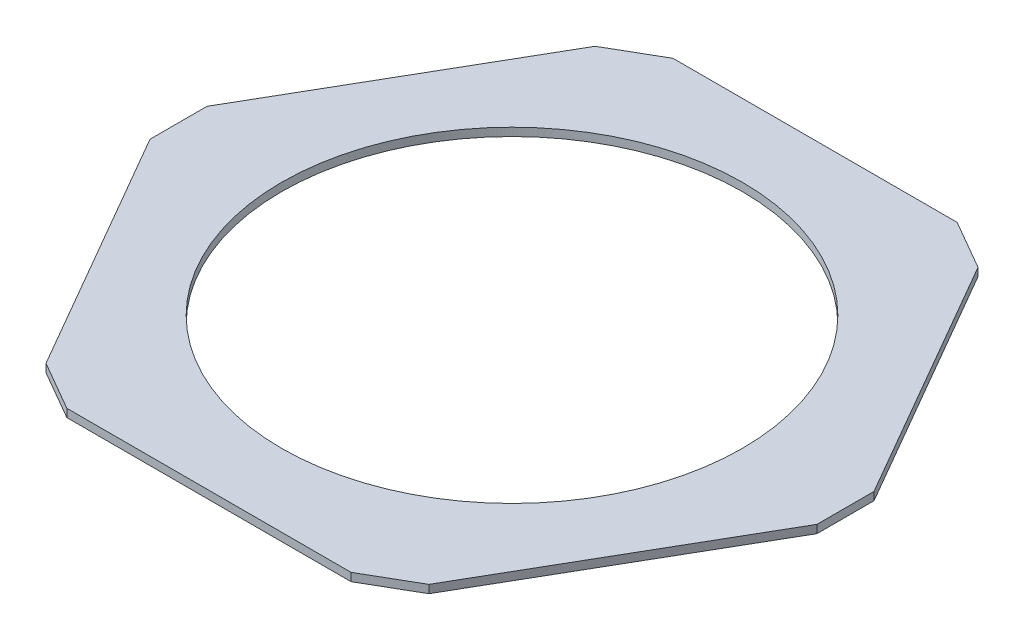
ISO-10303-21;
HEADER;
FILE_DESCRIPTION(('STEP AP214'),'2;1');
FILE_NAME('part.step','',(''),(''),'','','');
FILE_SCHEMA(('AUTOMOTIVE_DESIGN { 1 0 10303 214 1 1 1 1 }'));
ENDSEC;
DATA;
#1=APPLICATION_CONTEXT('core data for automotive mechanical design processes');
#2=APPLICATION_PROTOCOL_DEFINITION('international standard','automotive_design',2000,#1);
#3=PRODUCT_CONTEXT('',#1,'mechanical');
#4=PRODUCT('Part','Part','',(#3));
#5=PRODUCT_RELATED_PRODUCT_CATEGORY('part','',(#4));
#6=PRODUCT_DEFINITION_FORMATION('','',#4);
#7=PRODUCT_DEFINITION_CONTEXT('part definition',#1,'design');
#8=PRODUCT_DEFINITION('design','',#6,#7);
#9=PRODUCT_DEFINITION_SHAPE('','',#8);
#10=(LENGTH_UNIT() NAMED_UNIT(*) SI_UNIT(.MILLI.,.METRE.));
#11=(NAMED_UNIT(*) PLANE_ANGLE_UNIT() SI_UNIT($,.RADIAN.));
#12=(NAMED_UNIT(*) SI_UNIT($,.STERADIAN.) SOLID_ANGLE_UNIT());
#13=UNCERTAINTY_MEASURE_WITH_UNIT(LENGTH_MEASURE(1.E-05),#10,'distance_accuracy_value','');
#14=(GEOMETRIC_REPRESENTATION_CONTEXT(3) GLOBAL_UNCERTAINTY_ASSIGNED_CONTEXT((#13)) GLOBAL_UNIT_ASSIGNED_CONTEXT((#10,
#11,#12)) REPRESENTATION_CONTEXT('',''));
#15=CARTESIAN_POINT('',(0.,0.,0.));
#16=DIRECTION('',(0.,0.,1.));
#17=DIRECTION('',(1.,0.,0.));
#18=AXIS2_PLACEMENT_3D('',#15,#16,#17);
#19=CARTESIAN_POINT('',(438.317943801342,25.,-934.970880832121));
#20=DIRECTION('',(0.,0.,1.));
#21=DIRECTION('',(1.,0.,0.));
#22=AXIS2_PLACEMENT_3D('',#19,#20,#21);
#23=PLANE('',#22);
#24=DIRECTION('',(-1.,0.,0.));
#25=VECTOR('',#24,1.);
#26=CARTESIAN_POINT('',(438.317943801342,0.,-934.970880832121));
#27=LINE('',#26,#25);
#28=CARTESIAN_POINT('',(438.317943801342,0.,-934.970880832121));
#29=VERTEX_POINT('',#28);
#30=CARTESIAN_POINT('',(-438.317943801345,0.,-934.97088083212));
#31=VERTEX_POINT('',#30);
#32=EDGE_CURVE('E154',#29,#31,#27,.T.);
#33=ORIENTED_EDGE('',*,*,#32,.T.);
#34=DIRECTION('',(0.,-1.,0.));
#35=VECTOR('',#34,1.);
#36=CARTESIAN_POINT('',(-438.317943801345,25.,-934.97088083212));
#37=LINE('',#36,#35);
#38=CARTESIAN_POINT('',(-438.317943801345,25.,-934.97088083212));
#39=VERTEX_POINT('',#38);
#40=EDGE_CURVE('E11',#39,#31,#37,.T.);
#41=ORIENTED_EDGE('',*,*,#40,.F.);
#42=DIRECTION('',(-1.,0.,0.));
#43=VECTOR('',#42,1.);
#44=CARTESIAN_POINT('',(438.317943801342,25.,-934.970880832121));
#45=LINE('',#44,#43);
#46=CARTESIAN_POINT('',(438.317943801342,25.,-934.970880832121));
#47=VERTEX_POINT('',#46);
#48=EDGE_CURVE('E177',#47,#39,#45,.T.);
#49=ORIENTED_EDGE('',*,*,#48,.F.);
#50=DIRECTION('',(0.,-1.,0.));
#51=VECTOR('',#50,1.);
#52=CARTESIAN_POINT('',(438.317943801342,25.,-934.970880832121));
#53=LINE('',#52,#51);
#54=EDGE_CURVE('E150',#47,#29,#53,.T.);
#55=ORIENTED_EDGE('',*,*,#54,.T.);
#56=EDGE_LOOP('',(#33,#41,#49,#55));
#57=FACE_BOUND('',#56,.T.);
#58=ADVANCED_FACE('F34',(#57),#23,.F.);
#59=CARTESIAN_POINT('',(-590.549562698659,25.,-847.079914682582));
#60=DIRECTION('',(0.500000000000004,0.,0.866025403784436));
#61=DIRECTION('',(0.866025403784436,0.,-0.500000000000004));
#62=AXIS2_PLACEMENT_3D('',#59,#60,#61);
#63=PLANE('',#62);
#64=DIRECTION('',(-0.866025403784436,0.,0.500000000000004));
#65=VECTOR('',#64,1.);
#66=CARTESIAN_POINT('',(-590.549562698659,0.,-847.079914682582));
#67=LINE('',#66,#65);
#68=CARTESIAN_POINT('',(-590.549562698659,0.,-847.079914682582));
#69=VERTEX_POINT('',#68);
#70=EDGE_CURVE('E157',#31,#69,#67,.T.);
#71=ORIENTED_EDGE('',*,*,#70,.T.);
#72=DIRECTION('',(0.,-1.,0.));
#73=VECTOR('',#72,1.);
#74=CARTESIAN_POINT('',(-590.549562698659,25.,-847.079914682582));
#75=LINE('',#74,#73);
#76=CARTESIAN_POINT('',(-590.549562698659,25.,-847.079914682582));
#77=VERTEX_POINT('',#76);
#78=EDGE_CURVE('E42',#77,#69,#75,.T.);
#79=ORIENTED_EDGE('',*,*,#78,.F.);
#80=DIRECTION('',(-0.866025403784436,0.,0.500000000000004));
#81=VECTOR('',#80,1.);
#82=CARTESIAN_POINT('',(-590.549562698659,25.,-847.079914682582));
#83=LINE('',#82,#81);
#84=EDGE_CURVE('E105',#39,#77,#83,.T.);
#85=ORIENTED_EDGE('',*,*,#84,.F.);
#86=ORIENTED_EDGE('',*,*,#40,.T.);
#87=EDGE_LOOP('',(#71,#79,#85,#86));
#88=FACE_BOUND('',#87,.T.);
#89=ADVANCED_FACE('F256',(#88),#63,.F.);
#90=CARTESIAN_POINT('',(-590.549562698659,25.,-847.079914682582));
#91=DIRECTION('',(0.866025403784439,0.,0.499999999999999));
#92=DIRECTION('',(0.499999999999999,0.,-0.866025403784439));
#93=AXIS2_PLACEMENT_3D('',#90,#91,#92);
#94=PLANE('',#93);
#95=DIRECTION('',(-0.499999999999999,0.,0.866025403784439));
#96=VECTOR('',#95,1.);
#97=CARTESIAN_POINT('',(-590.549562698659,0.,-847.079914682582));
#98=LINE('',#97,#96);
#99=CARTESIAN_POINT('',(-1028.8675065,0.,-87.8909661495356));
#100=VERTEX_POINT('',#99);
#101=EDGE_CURVE('E160',#69,#100,#98,.T.);
#102=ORIENTED_EDGE('',*,*,#101,.T.);
#103=DIRECTION('',(0.,-1.,0.));
#104=VECTOR('',#103,1.);
#105=CARTESIAN_POINT('',(-1028.8675065,25.,-87.8909661495356));
#106=LINE('',#105,#104);
#107=CARTESIAN_POINT('',(-1028.8675065,25.,-87.8909661495356));
#108=VERTEX_POINT('',#107);
#109=EDGE_CURVE('E196',#108,#100,#106,.T.);
#110=ORIENTED_EDGE('',*,*,#109,.F.);
#111=DIRECTION('',(-0.499999999999999,0.,0.866025403784439));
#112=VECTOR('',#111,1.);
#113=CARTESIAN_POINT('',(-590.549562698659,25.,-847.079914682582));
#114=LINE('',#113,#112);
#115=EDGE_CURVE('E204',#77,#108,#114,.T.);
#116=ORIENTED_EDGE('',*,*,#115,.F.);
#117=ORIENTED_EDGE('',*,*,#78,.T.);
#118=EDGE_LOOP('',(#102,#110,#116,#117));
#119=FACE_BOUND('',#118,.T.);
#120=ADVANCED_FACE('F202',(#119),#94,.F.);
#121=CARTESIAN_POINT('',(-1028.8675065,25.,87.8909661495384));
#122=DIRECTION('',(1.,0.,0.));
#123=DIRECTION('',(0.,0.,-1.));
#124=AXIS2_PLACEMENT_3D('',#121,#122,#123);
#125=PLANE('',#124);
#126=DIRECTION('',(0.,0.,1.));
#127=VECTOR('',#126,1.);
#128=CARTESIAN_POINT('',(-1028.8675065,0.,87.8909661495384));
#129=LINE('',#128,#127);
#130=CARTESIAN_POINT('',(-1028.8675065,0.,87.8909661495384));
#131=VERTEX_POINT('',#130);
#132=EDGE_CURVE('E162',#100,#131,#129,.T.);
#133=ORIENTED_EDGE('',*,*,#132,.T.);
#134=DIRECTION('',(0.,-1.,0.));
#135=VECTOR('',#134,1.);
#136=CARTESIAN_POINT('',(-1028.8675065,25.,87.8909661495384));
#137=LINE('',#136,#135);
#138=CARTESIAN_POINT('',(-1028.8675065,25.,87.8909661495384));
#139=VERTEX_POINT('',#138);
#140=EDGE_CURVE('E193',#139,#131,#137,.T.);
#141=ORIENTED_EDGE('',*,*,#140,.F.);
#142=DIRECTION('',(0.,0.,1.));
#143=VECTOR('',#142,1.);
#144=CARTESIAN_POINT('',(-1028.8675065,25.,87.8909661495384));
#145=LINE('',#144,#143);
#146=EDGE_CURVE('E222',#108,#139,#145,.T.);
#147=ORIENTED_EDGE('',*,*,#146,.F.);
#148=ORIENTED_EDGE('',*,*,#109,.T.);
#149=EDGE_LOOP('',(#133,#141,#147,#148));
#150=FACE_BOUND('',#149,.T.);
#151=ADVANCED_FACE('F213',(#150),#125,.F.);
#152=CARTESIAN_POINT('',(-1028.8675065,25.,87.8909661495384));
#153=DIRECTION('',(0.866025403784439,0.,-0.5));
#154=DIRECTION('',(-0.5,0.,-0.866025403784439));
#155=AXIS2_PLACEMENT_3D('',#152,#153,#154);
#156=PLANE('',#155);
#157=DIRECTION('',(0.5,0.,0.866025403784439));
#158=VECTOR('',#157,1.);
#159=CARTESIAN_POINT('',(-1028.8675065,0.,87.8909661495384));
#160=LINE('',#159,#158);
#161=CARTESIAN_POINT('',(-590.549562698658,0.,847.079914682584));
#162=VERTEX_POINT('',#161);
#163=EDGE_CURVE('E164',#131,#162,#160,.T.);
#164=ORIENTED_EDGE('',*,*,#163,.T.);
#165=DIRECTION('',(0.,-1.,0.));
#166=VECTOR('',#165,1.);
#167=CARTESIAN_POINT('',(-590.549562698658,25.,847.079914682584));
#168=LINE('',#167,#166);
#169=CARTESIAN_POINT('',(-590.549562698658,25.,847.079914682584));
#170=VERTEX_POINT('',#169);
#171=EDGE_CURVE('E190',#170,#162,#168,.T.);
#172=ORIENTED_EDGE('',*,*,#171,.F.);
#173=DIRECTION('',(0.5,0.,0.866025403784439));
#174=VECTOR('',#173,1.);
#175=CARTESIAN_POINT('',(-1028.8675065,25.,87.8909661495384));
#176=LINE('',#175,#174);
#177=EDGE_CURVE('E219',#139,#170,#176,.T.);
#178=ORIENTED_EDGE('',*,*,#177,.F.);
#179=ORIENTED_EDGE('',*,*,#140,.T.);
#180=EDGE_LOOP('',(#164,#172,#178,#179));
#181=FACE_BOUND('',#180,.T.);
#182=ADVANCED_FACE('F217',(#181),#156,.F.);
#183=CARTESIAN_POINT('',(-438.317943801341,25.,934.970880832121));
#184=DIRECTION('',(0.499999999999995,0.,-0.866025403784441));
#185=DIRECTION('',(-0.866025403784441,0.,-0.499999999999995));
#186=AXIS2_PLACEMENT_3D('',#183,#184,#185);
#187=PLANE('',#186);
#188=DIRECTION('',(0.866025403784441,0.,0.499999999999995));
#189=VECTOR('',#188,1.);
#190=CARTESIAN_POINT('',(-438.317943801341,0.,934.970880832121));
#191=LINE('',#190,#189);
#192=CARTESIAN_POINT('',(-438.317943801341,0.,934.970880832121));
#193=VERTEX_POINT('',#192);
#194=EDGE_CURVE('E166',#162,#193,#191,.T.);
#195=ORIENTED_EDGE('',*,*,#194,.T.);
#196=DIRECTION('',(0.,-1.,0.));
#197=VECTOR('',#196,1.);
#198=CARTESIAN_POINT('',(-438.317943801341,25.,934.970880832121));
#199=LINE('',#198,#197);
#200=CARTESIAN_POINT('',(-438.317943801341,25.,934.970880832121));
#201=VERTEX_POINT('',#200);
#202=EDGE_CURVE('E187',#201,#193,#199,.T.);
#203=ORIENTED_EDGE('',*,*,#202,.F.);
#204=DIRECTION('',(0.866025403784441,0.,0.499999999999995));
#205=VECTOR('',#204,1.);
#206=CARTESIAN_POINT('',(-438.317943801341,25.,934.970880832121));
#207=LINE('',#206,#205);
#208=EDGE_CURVE('E221',#170,#201,#207,.T.);
#209=ORIENTED_EDGE('',*,*,#208,.F.);
#210=ORIENTED_EDGE('',*,*,#171,.T.);
#211=EDGE_LOOP('',(#195,#203,#209,#210));
#212=FACE_BOUND('',#211,.T.);
#213=ADVANCED_FACE('F269',(#212),#187,.F.);
#214=CARTESIAN_POINT('',(-438.317943801341,25.,934.970880832121));
#215=DIRECTION('',(0.,0.,-1.));
#216=DIRECTION('',(-1.,0.,0.));
#217=AXIS2_PLACEMENT_3D('',#214,#215,#216);
#218=PLANE('',#217);
#219=DIRECTION('',(1.,0.,0.));
#220=VECTOR('',#219,1.);
#221=CARTESIAN_POINT('',(-438.317943801341,0.,934.970880832121));
#222=LINE('',#221,#220);
#223=CARTESIAN_POINT('',(438.317943801344,0.,934.97088083212));
#224=VERTEX_POINT('',#223);
#225=EDGE_CURVE('E168',#193,#224,#222,.T.);
#226=ORIENTED_EDGE('',*,*,#225,.T.);
#227=DIRECTION('',(0.,-1.,0.));
#228=VECTOR('',#227,1.);
#229=CARTESIAN_POINT('',(438.317943801344,25.,934.97088083212));
#230=LINE('',#229,#228);
#231=CARTESIAN_POINT('',(438.317943801344,25.,934.97088083212));
#232=VERTEX_POINT('',#231);
#233=EDGE_CURVE('E184',#232,#224,#230,.T.);
#234=ORIENTED_EDGE('',*,*,#233,.F.);
#235=DIRECTION('',(1.,0.,0.));
#236=VECTOR('',#235,1.);
#237=CARTESIAN_POINT('',(-438.317943801341,25.,934.970880832121));
#238=LINE('',#237,#236);
#239=EDGE_CURVE('E224',#201,#232,#238,.T.);
#240=ORIENTED_EDGE('',*,*,#239,.F.);
#241=ORIENTED_EDGE('',*,*,#202,.T.);
#242=EDGE_LOOP('',(#226,#234,#240,#241));
#243=FACE_BOUND('',#242,.T.);
#244=ADVANCED_FACE('F272',(#243),#218,.F.);
#245=CARTESIAN_POINT('',(590.549562698659,25.,847.079914682582));
#246=DIRECTION('',(-0.500000000000005,0.,-0.866025403784436));
#247=DIRECTION('',(-0.866025403784436,0.,0.500000000000005));
#248=AXIS2_PLACEMENT_3D('',#245,#246,#247);
#249=PLANE('',#248);
#250=DIRECTION('',(0.866025403784436,0.,-0.500000000000005));
#251=VECTOR('',#250,1.);
#252=CARTESIAN_POINT('',(590.549562698659,0.,847.079914682582));
#253=LINE('',#252,#251);
#254=CARTESIAN_POINT('',(590.549562698659,0.,847.079914682582));
#255=VERTEX_POINT('',#254);
#256=EDGE_CURVE('E170',#224,#255,#253,.T.);
#257=ORIENTED_EDGE('',*,*,#256,.T.);
#258=DIRECTION('',(0.,-1.,0.));
#259=VECTOR('',#258,1.);
#260=CARTESIAN_POINT('',(590.549562698659,25.,847.079914682582));
#261=LINE('',#260,#259);
#262=CARTESIAN_POINT('',(590.549562698659,25.,847.079914682582));
#263=VERTEX_POINT('',#262);
#264=EDGE_CURVE('E181',#263,#255,#261,.T.);
#265=ORIENTED_EDGE('',*,*,#264,.F.);
#266=DIRECTION('',(0.866025403784436,0.,-0.500000000000005));
#267=VECTOR('',#266,1.);
#268=CARTESIAN_POINT('',(590.549562698659,25.,847.079914682582));
#269=LINE('',#268,#267);
#270=EDGE_CURVE('E230',#232,#263,#269,.T.);
#271=ORIENTED_EDGE('',*,*,#270,.F.);
#272=ORIENTED_EDGE('',*,*,#233,.T.);
#273=EDGE_LOOP('',(#257,#265,#271,#272));
#274=FACE_BOUND('',#273,.T.);
#275=ADVANCED_FACE('F236',(#274),#249,.F.);
#276=CARTESIAN_POINT('',(590.549562698659,25.,847.079914682582));
#277=DIRECTION('',(-0.866025403784439,0.,-0.499999999999999));
#278=DIRECTION('',(-0.499999999999999,0.,0.866025403784439));
#279=AXIS2_PLACEMENT_3D('',#276,#277,#278);
#280=PLANE('',#279);
#281=DIRECTION('',(0.499999999999999,0.,-0.866025403784439));
#282=VECTOR('',#281,1.);
#283=CARTESIAN_POINT('',(590.549562698659,0.,847.079914682582));
#284=LINE('',#283,#282);
#285=CARTESIAN_POINT('',(1028.8675065,0.,87.890966149536));
#286=VERTEX_POINT('',#285);
#287=EDGE_CURVE('E172',#255,#286,#284,.T.);
#288=ORIENTED_EDGE('',*,*,#287,.T.);
#289=DIRECTION('',(0.,-1.,0.));
#290=VECTOR('',#289,1.);
#291=CARTESIAN_POINT('',(1028.8675065,25.,87.890966149536));
#292=LINE('',#291,#290);
#293=CARTESIAN_POINT('',(1028.8675065,25.,87.890966149536));
#294=VERTEX_POINT('',#293);
#295=EDGE_CURVE('E145',#294,#286,#292,.T.);
#296=ORIENTED_EDGE('',*,*,#295,.F.);
#297=DIRECTION('',(0.499999999999999,0.,-0.866025403784439));
#298=VECTOR('',#297,1.);
#299=CARTESIAN_POINT('',(590.549562698659,25.,847.079914682582));
#300=LINE('',#299,#298);
#301=EDGE_CURVE('E136',#263,#294,#300,.T.);
#302=ORIENTED_EDGE('',*,*,#301,.F.);
#303=ORIENTED_EDGE('',*,*,#264,.T.);
#304=EDGE_LOOP('',(#288,#296,#302,#303));
#305=FACE_BOUND('',#304,.T.);
#306=ADVANCED_FACE('F240',(#305),#280,.F.);
#307=CARTESIAN_POINT('',(1028.8675065,25.,-87.8909661495387));
#308=DIRECTION('',(-1.,0.,0.));
#309=DIRECTION('',(0.,0.,1.));
#310=AXIS2_PLACEMENT_3D('',#307,#308,#309);
#311=PLANE('',#310);
#312=DIRECTION('',(0.,0.,-1.));
#313=VECTOR('',#312,1.);
#314=CARTESIAN_POINT('',(1028.8675065,0.,-87.8909661495387));
#315=LINE('',#314,#313);
#316=CARTESIAN_POINT('',(1028.8675065,0.,-87.8909661495387));
#317=VERTEX_POINT('',#316);
#318=EDGE_CURVE('E144',#286,#317,#315,.T.);
#319=ORIENTED_EDGE('',*,*,#318,.T.);
#320=DIRECTION('',(0.,-1.,0.));
#321=VECTOR('',#320,1.);
#322=CARTESIAN_POINT('',(1028.8675065,25.,-87.8909661495387));
#323=LINE('',#322,#321);
#324=CARTESIAN_POINT('',(1028.8675065,25.,-87.8909661495387));
#325=VERTEX_POINT('',#324);
#326=EDGE_CURVE('E141',#325,#317,#323,.T.);
#327=ORIENTED_EDGE('',*,*,#326,.F.);
#328=DIRECTION('',(0.,0.,-1.));
#329=VECTOR('',#328,1.);
#330=CARTESIAN_POINT('',(1028.8675065,25.,-87.8909661495387));
#331=LINE('',#330,#329);
#332=EDGE_CURVE('E130',#294,#325,#331,.T.);
#333=ORIENTED_EDGE('',*,*,#332,.F.);
#334=ORIENTED_EDGE('',*,*,#295,.T.);
#335=EDGE_LOOP('',(#319,#327,#333,#334));
#336=FACE_BOUND('',#335,.T.);
#337=ADVANCED_FACE('F142',(#336),#311,.F.);
#338=CARTESIAN_POINT('',(1028.8675065,25.,-87.8909661495387));
#339=DIRECTION('',(-0.866025403784438,0.,0.500000000000001));
#340=DIRECTION('',(0.500000000000001,0.,0.866025403784438));
#341=AXIS2_PLACEMENT_3D('',#338,#339,#340);
#342=PLANE('',#341);
#343=DIRECTION('',(-0.500000000000001,0.,-0.866025403784438));
#344=VECTOR('',#343,1.);
#345=CARTESIAN_POINT('',(1028.8675065,0.,-87.8909661495387));
#346=LINE('',#345,#344);
#347=CARTESIAN_POINT('',(590.549562698657,0.,-847.079914682584));
#348=VERTEX_POINT('',#347);
#349=EDGE_CURVE('E91',#317,#348,#346,.T.);
#350=ORIENTED_EDGE('',*,*,#349,.T.);
#351=DIRECTION('',(0.,-1.,0.));
#352=VECTOR('',#351,1.);
#353=CARTESIAN_POINT('',(590.549562698657,25.,-847.079914682584));
#354=LINE('',#353,#352);
#355=CARTESIAN_POINT('',(590.549562698657,25.,-847.079914682584));
#356=VERTEX_POINT('',#355);
#357=EDGE_CURVE('E146',#356,#348,#354,.T.);
#358=ORIENTED_EDGE('',*,*,#357,.F.);
#359=DIRECTION('',(-0.500000000000001,0.,-0.866025403784438));
#360=VECTOR('',#359,1.);
#361=CARTESIAN_POINT('',(1028.8675065,25.,-87.8909661495387));
#362=LINE('',#361,#360);
#363=EDGE_CURVE('E134',#325,#356,#362,.T.);
#364=ORIENTED_EDGE('',*,*,#363,.F.);
#365=ORIENTED_EDGE('',*,*,#326,.T.);
#366=EDGE_LOOP('',(#350,#358,#364,#365));
#367=FACE_BOUND('',#366,.T.);
#368=ADVANCED_FACE('F148',(#367),#342,.F.);
#369=CARTESIAN_POINT('',(438.317943801342,25.,-934.970880832121));
#370=DIRECTION('',(-0.499999999999996,0.,0.866025403784441));
#371=DIRECTION('',(0.866025403784441,0.,0.499999999999996));
#372=AXIS2_PLACEMENT_3D('',#369,#370,#371);
#373=PLANE('',#372);
#374=DIRECTION('',(-0.866025403784441,0.,-0.499999999999996));
#375=VECTOR('',#374,1.);
#376=CARTESIAN_POINT('',(438.317943801342,0.,-934.970880832121));
#377=LINE('',#376,#375);
#378=EDGE_CURVE('E97',#348,#29,#377,.T.);
#379=ORIENTED_EDGE('',*,*,#378,.T.);
#380=ORIENTED_EDGE('',*,*,#54,.F.);
#381=DIRECTION('',(-0.866025403784441,0.,-0.499999999999996));
#382=VECTOR('',#381,1.);
#383=CARTESIAN_POINT('',(438.317943801342,25.,-934.970880832121));
#384=LINE('',#383,#382);
#385=EDGE_CURVE('E50',#356,#47,#384,.T.);
#386=ORIENTED_EDGE('',*,*,#385,.F.);
#387=ORIENTED_EDGE('',*,*,#357,.T.);
#388=EDGE_LOOP('',(#379,#380,#386,#387));
#389=FACE_BOUND('',#388,.T.);
#390=ADVANCED_FACE('F244',(#389),#373,.F.);
#391=CARTESIAN_POINT('',(0.,25.,0.));
#392=DIRECTION('',(0.,-1.,0.));
#393=DIRECTION('',(0.,0.,-1.));
#394=AXIS2_PLACEMENT_3D('',#391,#392,#393);
#395=PLANE('',#394);
#396=CARTESIAN_POINT('',(0.,25.,0.));
#397=DIRECTION('',(0.,-1.,0.));
#398=DIRECTION('',(0.,0.,-1.));
#399=AXIS2_PLACEMENT_3D('',#396,#397,#398);
#400=CIRCLE('',#399,710.8712965);
#401=CARTESIAN_POINT('',(0.,25.,-710.8712965));
#402=VERTEX_POINT('',#401);
#403=EDGE_CURVE('E327',#402,#402,#400,.T.);
#404=ORIENTED_EDGE('',*,*,#403,.T.);
#405=EDGE_LOOP('',(#404));
#406=FACE_BOUND('',#405,.T.);
#407=ORIENTED_EDGE('',*,*,#48,.T.);
#408=ORIENTED_EDGE('',*,*,#84,.T.);
#409=ORIENTED_EDGE('',*,*,#115,.T.);
#410=ORIENTED_EDGE('',*,*,#146,.T.);
#411=ORIENTED_EDGE('',*,*,#177,.T.);
#412=ORIENTED_EDGE('',*,*,#208,.T.);
#413=ORIENTED_EDGE('',*,*,#239,.T.);
#414=ORIENTED_EDGE('',*,*,#270,.T.);
#415=ORIENTED_EDGE('',*,*,#301,.T.);
#416=ORIENTED_EDGE('',*,*,#332,.T.);
#417=ORIENTED_EDGE('',*,*,#363,.T.);
#418=ORIENTED_EDGE('',*,*,#385,.T.);
#419=EDGE_LOOP('',(#407,#408,#409,#410,#411,#412,#413,#414,#415,#416,#417,#418));
#420=FACE_BOUND('',#419,.T.);
#421=ADVANCED_FACE('F132',(#406,#420),#395,.F.);
#422=CARTESIAN_POINT('',(0.,0.,0.));
#423=DIRECTION('',(0.,-1.,0.));
#424=DIRECTION('',(0.,0.,-1.));
#425=AXIS2_PLACEMENT_3D('',#422,#423,#424);
#426=PLANE('',#425);
#427=CARTESIAN_POINT('',(0.,0.,0.));
#428=DIRECTION('',(0.,1.,0.));
#429=DIRECTION('',(0.,0.,1.));
#430=AXIS2_PLACEMENT_3D('',#427,#428,#429);
#431=CIRCLE('',#430,710.8712965);
#432=CARTESIAN_POINT('',(0.,0.,710.8712965));
#433=VERTEX_POINT('',#432);
#434=EDGE_CURVE('E158',#433,#433,#431,.T.);
#435=ORIENTED_EDGE('',*,*,#434,.T.);
#436=EDGE_LOOP('',(#435));
#437=FACE_BOUND('',#436,.T.);
#438=ORIENTED_EDGE('',*,*,#32,.F.);
#439=ORIENTED_EDGE('',*,*,#378,.F.);
#440=ORIENTED_EDGE('',*,*,#349,.F.);
#441=ORIENTED_EDGE('',*,*,#318,.F.);
#442=ORIENTED_EDGE('',*,*,#287,.F.);
#443=ORIENTED_EDGE('',*,*,#256,.F.);
#444=ORIENTED_EDGE('',*,*,#225,.F.);
#445=ORIENTED_EDGE('',*,*,#194,.F.);
#446=ORIENTED_EDGE('',*,*,#163,.F.);
#447=ORIENTED_EDGE('',*,*,#132,.F.);
#448=ORIENTED_EDGE('',*,*,#101,.F.);
#449=ORIENTED_EDGE('',*,*,#70,.F.);
#450=EDGE_LOOP('',(#438,#439,#440,#441,#442,#443,#444,#445,#446,#447,#448,#449));
#451=FACE_BOUND('',#450,.T.);
#452=ADVANCED_FACE('F208',(#437,#451),#426,.T.);
#453=CARTESIAN_POINT('',(0.,25.001,0.));
#454=DIRECTION('',(0.,-1.,0.));
#455=DIRECTION('',(0.,0.,-1.));
#456=AXIS2_PLACEMENT_3D('',#453,#454,#455);
#457=CYLINDRICAL_SURFACE('',#456,710.8712965);
#458=ORIENTED_EDGE('',*,*,#434,.F.);
#459=EDGE_LOOP('',(#458));
#460=FACE_BOUND('',#459,.T.);
#461=ORIENTED_EDGE('',*,*,#403,.F.);
#462=EDGE_LOOP('',(#461));
#463=FACE_BOUND('',#462,.T.);
#464=ADVANCED_FACE('F309',(#460,#463),#457,.F.);
#465=CLOSED_SHELL('',(#58,#89,#120,#151,#182,#213,#244,#275,#306,#337,#368,#390,#421,#452,#464));
#466=MANIFOLD_SOLID_BREP('B2',#465);
#467=ADVANCED_BREP_SHAPE_REPRESENTATION('',(#18,#466),#14);
#468=SHAPE_DEFINITION_REPRESENTATION(#9,#467);
ENDSEC;
END-ISO-10303-21;
